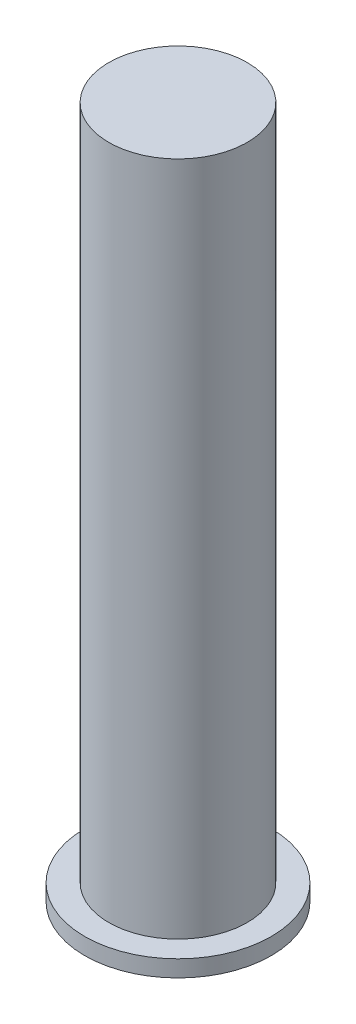
ISO-10303-21;
HEADER;
FILE_DESCRIPTION(('STEP AP214'),'2;1');
FILE_NAME('part.step','',(''),(''),'','','');
FILE_SCHEMA(('AUTOMOTIVE_DESIGN { 1 0 10303 214 1 1 1 1 }'));
ENDSEC;
DATA;
#1=APPLICATION_CONTEXT('core data for automotive mechanical design processes');
#2=APPLICATION_PROTOCOL_DEFINITION('international standard','automotive_design',2000,#1);
#3=PRODUCT_CONTEXT('',#1,'mechanical');
#4=PRODUCT('Part','Part','',(#3));
#5=PRODUCT_RELATED_PRODUCT_CATEGORY('part','',(#4));
#6=PRODUCT_DEFINITION_FORMATION('','',#4);
#7=PRODUCT_DEFINITION_CONTEXT('part definition',#1,'design');
#8=PRODUCT_DEFINITION('design','',#6,#7);
#9=PRODUCT_DEFINITION_SHAPE('','',#8);
#10=(LENGTH_UNIT() NAMED_UNIT(*) SI_UNIT(.MILLI.,.METRE.));
#11=(NAMED_UNIT(*) PLANE_ANGLE_UNIT() SI_UNIT($,.RADIAN.));
#12=(NAMED_UNIT(*) SI_UNIT($,.STERADIAN.) SOLID_ANGLE_UNIT());
#13=UNCERTAINTY_MEASURE_WITH_UNIT(LENGTH_MEASURE(1.E-05),#10,'distance_accuracy_value','');
#14=(GEOMETRIC_REPRESENTATION_CONTEXT(3) GLOBAL_UNCERTAINTY_ASSIGNED_CONTEXT((#13)) GLOBAL_UNIT_ASSIGNED_CONTEXT((#10,
#11,#12)) REPRESENTATION_CONTEXT('',''));
#15=CARTESIAN_POINT('',(0.,0.,0.));
#16=DIRECTION('',(0.,0.,1.));
#17=DIRECTION('',(1.,0.,0.));
#18=AXIS2_PLACEMENT_3D('',#15,#16,#17);
#19=CARTESIAN_POINT('',(0.,0.,0.));
#20=DIRECTION('',(0.,-1.,0.));
#21=DIRECTION('',(0.,0.,-1.));
#22=AXIS2_PLACEMENT_3D('',#19,#20,#21);
#23=PLANE('',#22);
#24=CARTESIAN_POINT('',(0.,0.,0.));
#25=DIRECTION('',(0.,-1.,0.));
#26=DIRECTION('',(0.,0.,-1.));
#27=AXIS2_PLACEMENT_3D('',#24,#25,#26);
#28=CIRCLE('',#27,4.2799);
#29=CARTESIAN_POINT('',(0.,0.,-4.2799));
#30=VERTEX_POINT('',#29);
#31=EDGE_CURVE('E16',#30,#30,#28,.F.);
#32=ORIENTED_EDGE('',*,*,#31,.F.);
#33=EDGE_LOOP('',(#32));
#34=FACE_BOUND('',#33,.T.);
#35=ADVANCED_FACE('F13',(#34),#23,.T.);
#36=CARTESIAN_POINT('',(0.,33.3375,0.));
#37=DIRECTION('',(0.,-1.,0.));
#38=DIRECTION('',(0.,0.,-1.));
#39=AXIS2_PLACEMENT_3D('',#36,#37,#38);
#40=CYLINDRICAL_SURFACE('',#39,4.2799);
#41=ORIENTED_EDGE('',*,*,#31,.T.);
#42=EDGE_LOOP('',(#41));
#43=FACE_BOUND('',#42,.T.);
#44=CARTESIAN_POINT('',(0.,0.761999999999999,0.));
#45=DIRECTION('',(0.,-1.,0.));
#46=DIRECTION('',(0.,0.,-1.));
#47=AXIS2_PLACEMENT_3D('',#44,#45,#46);
#48=CIRCLE('',#47,4.2799);
#49=CARTESIAN_POINT('',(0.,0.761999999999999,-4.2799));
#50=VERTEX_POINT('',#49);
#51=EDGE_CURVE('E25',#50,#50,#48,.T.);
#52=ORIENTED_EDGE('',*,*,#51,.T.);
#53=EDGE_LOOP('',(#52));
#54=FACE_BOUND('',#53,.T.);
#55=ADVANCED_FACE('F33',(#43,#54),#40,.T.);
#56=CARTESIAN_POINT('',(0.,31.75,0.));
#57=DIRECTION('',(0.,-1.,0.));
#58=DIRECTION('',(0.,0.,-1.));
#59=AXIS2_PLACEMENT_3D('',#56,#57,#58);
#60=PLANE('',#59);
#61=CARTESIAN_POINT('',(0.,31.75,0.));
#62=DIRECTION('',(0.,-1.,0.));
#63=DIRECTION('',(0.,0.,-1.));
#64=AXIS2_PLACEMENT_3D('',#61,#62,#63);
#65=CIRCLE('',#64,3.175);
#66=CARTESIAN_POINT('',(0.,31.75,-3.175));
#67=VERTEX_POINT('',#66);
#68=EDGE_CURVE('E20',#67,#67,#65,.T.);
#69=ORIENTED_EDGE('',*,*,#68,.F.);
#70=EDGE_LOOP('',(#69));
#71=FACE_BOUND('',#70,.T.);
#72=ADVANCED_FACE('F40',(#71),#60,.F.);
#73=CARTESIAN_POINT('',(0.,0.762,0.));
#74=DIRECTION('',(0.,-1.,0.));
#75=DIRECTION('',(0.,0.,-1.));
#76=AXIS2_PLACEMENT_3D('',#73,#74,#75);
#77=PLANE('',#76);
#78=CARTESIAN_POINT('',(0.,0.761999999999999,0.));
#79=DIRECTION('',(0.,-1.,0.));
#80=DIRECTION('',(0.,0.,-1.));
#81=AXIS2_PLACEMENT_3D('',#78,#79,#80);
#82=CIRCLE('',#81,3.175);
#83=CARTESIAN_POINT('',(0.,0.761999999999999,-3.175));
#84=VERTEX_POINT('',#83);
#85=EDGE_CURVE('E9',#84,#84,#82,.F.);
#86=ORIENTED_EDGE('',*,*,#85,.F.);
#87=EDGE_LOOP('',(#86));
#88=FACE_BOUND('',#87,.T.);
#89=ORIENTED_EDGE('',*,*,#51,.F.);
#90=EDGE_LOOP('',(#89));
#91=FACE_BOUND('',#90,.T.);
#92=ADVANCED_FACE('F43',(#88,#91),#77,.F.);
#93=CARTESIAN_POINT('',(0.,33.3375,0.));
#94=DIRECTION('',(0.,-1.,0.));
#95=DIRECTION('',(0.,0.,-1.));
#96=AXIS2_PLACEMENT_3D('',#93,#94,#95);
#97=CYLINDRICAL_SURFACE('',#96,3.175);
#98=ORIENTED_EDGE('',*,*,#85,.T.);
#99=EDGE_LOOP('',(#98));
#100=FACE_BOUND('',#99,.T.);
#101=ORIENTED_EDGE('',*,*,#68,.T.);
#102=EDGE_LOOP('',(#101));
#103=FACE_BOUND('',#102,.T.);
#104=ADVANCED_FACE('F41',(#100,#103),#97,.T.);
#105=CLOSED_SHELL('',(#35,#55,#72,#92,#104));
#106=MANIFOLD_SOLID_BREP('B1',#105);
#107=ADVANCED_BREP_SHAPE_REPRESENTATION('',(#18,#106),#14);
#108=SHAPE_DEFINITION_REPRESENTATION(#9,#107);
ENDSEC;
END-ISO-10303-21;
